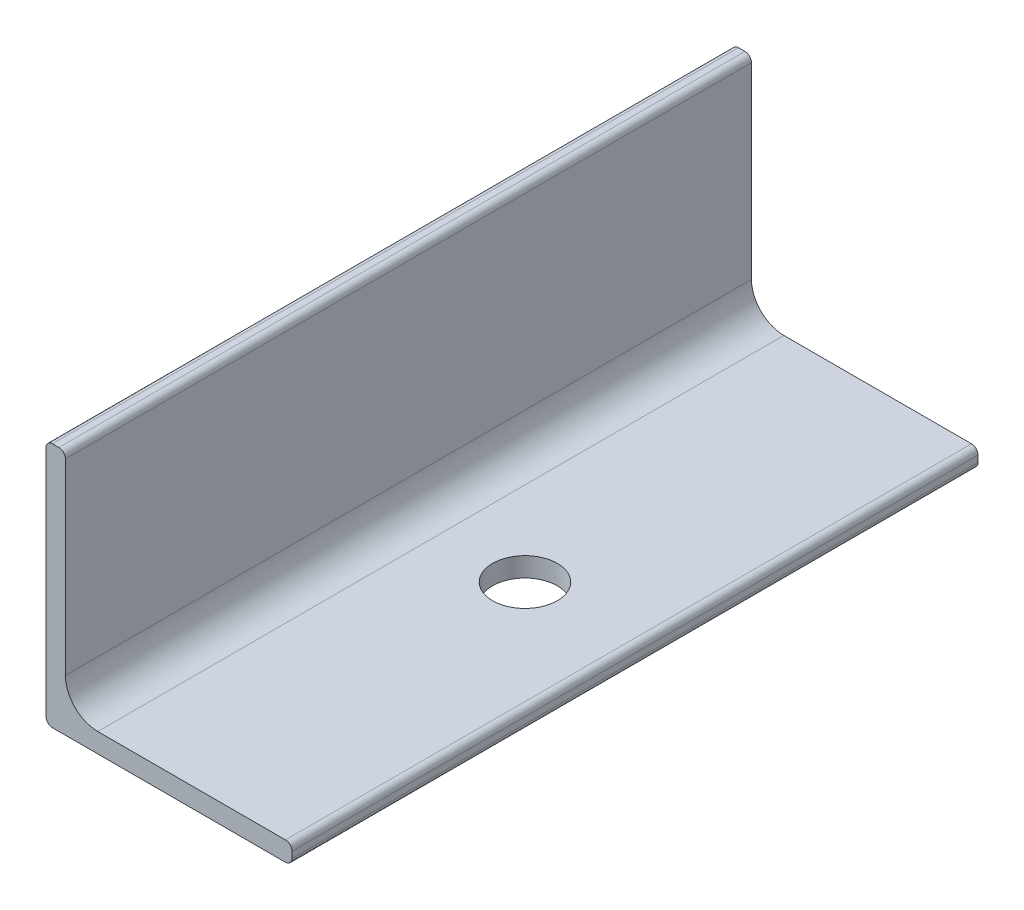
ISO-10303-21;
HEADER;
FILE_DESCRIPTION(('STEP AP214'),'2;1');
FILE_NAME('part.step','',(''),(''),'','','');
FILE_SCHEMA(('AUTOMOTIVE_DESIGN { 1 0 10303 214 1 1 1 1 }'));
ENDSEC;
DATA;
#1=APPLICATION_CONTEXT('core data for automotive mechanical design processes');
#2=APPLICATION_PROTOCOL_DEFINITION('international standard','automotive_design',2000,#1);
#3=PRODUCT_CONTEXT('',#1,'mechanical');
#4=PRODUCT('Part','Part','',(#3));
#5=PRODUCT_RELATED_PRODUCT_CATEGORY('part','',(#4));
#6=PRODUCT_DEFINITION_FORMATION('','',#4);
#7=PRODUCT_DEFINITION_CONTEXT('part definition',#1,'design');
#8=PRODUCT_DEFINITION('design','',#6,#7);
#9=PRODUCT_DEFINITION_SHAPE('','',#8);
#10=(LENGTH_UNIT() NAMED_UNIT(*) SI_UNIT(.MILLI.,.METRE.));
#11=(NAMED_UNIT(*) PLANE_ANGLE_UNIT() SI_UNIT($,.RADIAN.));
#12=(NAMED_UNIT(*) SI_UNIT($,.STERADIAN.) SOLID_ANGLE_UNIT());
#13=UNCERTAINTY_MEASURE_WITH_UNIT(LENGTH_MEASURE(1.E-05),#10,'distance_accuracy_value','');
#14=(GEOMETRIC_REPRESENTATION_CONTEXT(3) GLOBAL_UNCERTAINTY_ASSIGNED_CONTEXT((#13)) GLOBAL_UNIT_ASSIGNED_CONTEXT((#10,
#11,#12)) REPRESENTATION_CONTEXT('',''));
#15=CARTESIAN_POINT('',(0.,0.,0.));
#16=DIRECTION('',(0.,0.,1.));
#17=DIRECTION('',(1.,0.,0.));
#18=AXIS2_PLACEMENT_3D('',#15,#16,#17);
#19=CARTESIAN_POINT('',(8.,8.,53.));
#20=DIRECTION('',(0.,0.,-1.));
#21=DIRECTION('',(-1.,0.,0.));
#22=AXIS2_PLACEMENT_3D('',#19,#20,#21);
#23=CYLINDRICAL_SURFACE('',#22,5.);
#24=CARTESIAN_POINT('',(8.,8.,-53.));
#25=DIRECTION('',(0.,0.,-1.));
#26=DIRECTION('',(1.,0.,0.));
#27=AXIS2_PLACEMENT_3D('',#24,#25,#26);
#28=CIRCLE('',#27,5.);
#29=CARTESIAN_POINT('',(8.00000000000004,3.,-53.));
#30=VERTEX_POINT('',#29);
#31=CARTESIAN_POINT('',(3.,8.00000000000004,-53.));
#32=VERTEX_POINT('',#31);
#33=EDGE_CURVE('E161',#30,#32,#28,.T.);
#34=ORIENTED_EDGE('',*,*,#33,.T.);
#35=DIRECTION('',(0.,0.,-1.));
#36=VECTOR('',#35,1.);
#37=CARTESIAN_POINT('',(3.,8.00000000000004,53.));
#38=LINE('',#37,#36);
#39=CARTESIAN_POINT('',(3.,8.00000000000004,53.));
#40=VERTEX_POINT('',#39);
#41=EDGE_CURVE('E11',#40,#32,#38,.T.);
#42=ORIENTED_EDGE('',*,*,#41,.F.);
#43=CARTESIAN_POINT('',(8.,8.,53.));
#44=DIRECTION('',(0.,0.,-1.));
#45=DIRECTION('',(1.,0.,0.));
#46=AXIS2_PLACEMENT_3D('',#43,#44,#45);
#47=CIRCLE('',#46,5.);
#48=CARTESIAN_POINT('',(8.00000000000004,3.,53.));
#49=VERTEX_POINT('',#48);
#50=EDGE_CURVE('E184',#49,#40,#47,.T.);
#51=ORIENTED_EDGE('',*,*,#50,.F.);
#52=DIRECTION('',(0.,0.,-1.));
#53=VECTOR('',#52,1.);
#54=CARTESIAN_POINT('',(8.00000000000004,3.,53.));
#55=LINE('',#54,#53);
#56=EDGE_CURVE('E157',#49,#30,#55,.T.);
#57=ORIENTED_EDGE('',*,*,#56,.T.);
#58=EDGE_LOOP('',(#34,#42,#51,#57));
#59=FACE_BOUND('',#58,.T.);
#60=ADVANCED_FACE('F41',(#59),#23,.F.);
#61=CARTESIAN_POINT('',(3.,37.,53.));
#62=DIRECTION('',(-1.,0.,0.));
#63=DIRECTION('',(0.,-1.,0.));
#64=AXIS2_PLACEMENT_3D('',#61,#62,#63);
#65=PLANE('',#64);
#66=DIRECTION('',(0.,1.,0.));
#67=VECTOR('',#66,1.);
#68=CARTESIAN_POINT('',(3.,37.,-53.));
#69=LINE('',#68,#67);
#70=CARTESIAN_POINT('',(3.,37.,-53.));
#71=VERTEX_POINT('',#70);
#72=EDGE_CURVE('E164',#32,#71,#69,.T.);
#73=ORIENTED_EDGE('',*,*,#72,.T.);
#74=DIRECTION('',(0.,0.,-1.));
#75=VECTOR('',#74,1.);
#76=CARTESIAN_POINT('',(3.,37.,53.));
#77=LINE('',#76,#75);
#78=CARTESIAN_POINT('',(3.,37.,53.));
#79=VERTEX_POINT('',#78);
#80=EDGE_CURVE('E49',#79,#71,#77,.T.);
#81=ORIENTED_EDGE('',*,*,#80,.F.);
#82=DIRECTION('',(0.,1.,0.));
#83=VECTOR('',#82,1.);
#84=CARTESIAN_POINT('',(3.,37.,53.));
#85=LINE('',#84,#83);
#86=EDGE_CURVE('E112',#40,#79,#85,.T.);
#87=ORIENTED_EDGE('',*,*,#86,.F.);
#88=ORIENTED_EDGE('',*,*,#41,.T.);
#89=EDGE_LOOP('',(#73,#81,#87,#88));
#90=FACE_BOUND('',#89,.T.);
#91=ADVANCED_FACE('F266',(#90),#65,.F.);
#92=CARTESIAN_POINT('',(2.,37.,53.));
#93=DIRECTION('',(0.,0.,-1.));
#94=DIRECTION('',(-1.,0.,0.));
#95=AXIS2_PLACEMENT_3D('',#92,#93,#94);
#96=CYLINDRICAL_SURFACE('',#95,1.);
#97=CARTESIAN_POINT('',(2.,37.,-53.));
#98=DIRECTION('',(0.,0.,1.));
#99=DIRECTION('',(-1.,0.,0.));
#100=AXIS2_PLACEMENT_3D('',#97,#98,#99);
#101=CIRCLE('',#100,1.);
#102=CARTESIAN_POINT('',(1.99999999999999,38.,-53.));
#103=VERTEX_POINT('',#102);
#104=EDGE_CURVE('E167',#71,#103,#101,.T.);
#105=ORIENTED_EDGE('',*,*,#104,.T.);
#106=DIRECTION('',(0.,0.,-1.));
#107=VECTOR('',#106,1.);
#108=CARTESIAN_POINT('',(1.99999999999999,38.,53.));
#109=LINE('',#108,#107);
#110=CARTESIAN_POINT('',(1.99999999999999,38.,53.));
#111=VERTEX_POINT('',#110);
#112=EDGE_CURVE('E203',#111,#103,#109,.T.);
#113=ORIENTED_EDGE('',*,*,#112,.F.);
#114=CARTESIAN_POINT('',(2.,37.,53.));
#115=DIRECTION('',(0.,0.,1.));
#116=DIRECTION('',(-1.,0.,0.));
#117=AXIS2_PLACEMENT_3D('',#114,#115,#116);
#118=CIRCLE('',#117,1.);
#119=EDGE_CURVE('E211',#79,#111,#118,.T.);
#120=ORIENTED_EDGE('',*,*,#119,.F.);
#121=ORIENTED_EDGE('',*,*,#80,.T.);
#122=EDGE_LOOP('',(#105,#113,#120,#121));
#123=FACE_BOUND('',#122,.T.);
#124=ADVANCED_FACE('F209',(#123),#96,.T.);
#125=CARTESIAN_POINT('',(1.00000000000001,38.,53.));
#126=DIRECTION('',(0.,-1.,0.));
#127=DIRECTION('',(0.,0.,-1.));
#128=AXIS2_PLACEMENT_3D('',#125,#126,#127);
#129=PLANE('',#128);
#130=DIRECTION('',(-1.,0.,0.));
#131=VECTOR('',#130,1.);
#132=CARTESIAN_POINT('',(1.00000000000001,38.,-53.));
#133=LINE('',#132,#131);
#134=CARTESIAN_POINT('',(1.00000000000001,38.,-53.));
#135=VERTEX_POINT('',#134);
#136=EDGE_CURVE('E169',#103,#135,#133,.T.);
#137=ORIENTED_EDGE('',*,*,#136,.T.);
#138=DIRECTION('',(0.,0.,-1.));
#139=VECTOR('',#138,1.);
#140=CARTESIAN_POINT('',(1.00000000000001,38.,53.));
#141=LINE('',#140,#139);
#142=CARTESIAN_POINT('',(1.00000000000001,38.,53.));
#143=VERTEX_POINT('',#142);
#144=EDGE_CURVE('E200',#143,#135,#141,.T.);
#145=ORIENTED_EDGE('',*,*,#144,.F.);
#146=DIRECTION('',(-1.,0.,0.));
#147=VECTOR('',#146,1.);
#148=CARTESIAN_POINT('',(1.00000000000001,38.,53.));
#149=LINE('',#148,#147);
#150=EDGE_CURVE('E229',#111,#143,#149,.T.);
#151=ORIENTED_EDGE('',*,*,#150,.F.);
#152=ORIENTED_EDGE('',*,*,#112,.T.);
#153=EDGE_LOOP('',(#137,#145,#151,#152));
#154=FACE_BOUND('',#153,.T.);
#155=ADVANCED_FACE('F220',(#154),#129,.F.);
#156=CARTESIAN_POINT('',(1.,37.,53.));
#157=DIRECTION('',(0.,0.,-1.));
#158=DIRECTION('',(-1.,0.,0.));
#159=AXIS2_PLACEMENT_3D('',#156,#157,#158);
#160=CYLINDRICAL_SURFACE('',#159,1.);
#161=CARTESIAN_POINT('',(1.,37.,-53.));
#162=DIRECTION('',(0.,0.,1.));
#163=DIRECTION('',(-1.,0.,0.));
#164=AXIS2_PLACEMENT_3D('',#161,#162,#163);
#165=CIRCLE('',#164,1.);
#166=CARTESIAN_POINT('',(0.,37.,-53.));
#167=VERTEX_POINT('',#166);
#168=EDGE_CURVE('E171',#135,#167,#165,.T.);
#169=ORIENTED_EDGE('',*,*,#168,.T.);
#170=DIRECTION('',(0.,0.,-1.));
#171=VECTOR('',#170,1.);
#172=CARTESIAN_POINT('',(0.,37.,53.));
#173=LINE('',#172,#171);
#174=CARTESIAN_POINT('',(0.,37.,53.));
#175=VERTEX_POINT('',#174);
#176=EDGE_CURVE('E197',#175,#167,#173,.T.);
#177=ORIENTED_EDGE('',*,*,#176,.F.);
#178=CARTESIAN_POINT('',(1.,37.,53.));
#179=DIRECTION('',(0.,0.,1.));
#180=DIRECTION('',(-1.,0.,0.));
#181=AXIS2_PLACEMENT_3D('',#178,#179,#180);
#182=CIRCLE('',#181,1.);
#183=EDGE_CURVE('E226',#143,#175,#182,.T.);
#184=ORIENTED_EDGE('',*,*,#183,.F.);
#185=ORIENTED_EDGE('',*,*,#144,.T.);
#186=EDGE_LOOP('',(#169,#177,#184,#185));
#187=FACE_BOUND('',#186,.T.);
#188=ADVANCED_FACE('F224',(#187),#160,.T.);
#189=CARTESIAN_POINT('',(0.,1.00000000000001,53.));
#190=DIRECTION('',(1.,0.,0.));
#191=DIRECTION('',(0.,0.,-1.));
#192=AXIS2_PLACEMENT_3D('',#189,#190,#191);
#193=PLANE('',#192);
#194=DIRECTION('',(0.,-1.,0.));
#195=VECTOR('',#194,1.);
#196=CARTESIAN_POINT('',(0.,1.00000000000001,-53.));
#197=LINE('',#196,#195);
#198=CARTESIAN_POINT('',(0.,1.00000000000001,-53.));
#199=VERTEX_POINT('',#198);
#200=EDGE_CURVE('E173',#167,#199,#197,.T.);
#201=ORIENTED_EDGE('',*,*,#200,.T.);
#202=DIRECTION('',(0.,0.,-1.));
#203=VECTOR('',#202,1.);
#204=CARTESIAN_POINT('',(0.,1.00000000000001,53.));
#205=LINE('',#204,#203);
#206=CARTESIAN_POINT('',(0.,1.00000000000001,53.));
#207=VERTEX_POINT('',#206);
#208=EDGE_CURVE('E194',#207,#199,#205,.T.);
#209=ORIENTED_EDGE('',*,*,#208,.F.);
#210=DIRECTION('',(0.,-1.,0.));
#211=VECTOR('',#210,1.);
#212=CARTESIAN_POINT('',(0.,1.00000000000001,53.));
#213=LINE('',#212,#211);
#214=EDGE_CURVE('E228',#175,#207,#213,.T.);
#215=ORIENTED_EDGE('',*,*,#214,.F.);
#216=ORIENTED_EDGE('',*,*,#176,.T.);
#217=EDGE_LOOP('',(#201,#209,#215,#216));
#218=FACE_BOUND('',#217,.T.);
#219=ADVANCED_FACE('F279',(#218),#193,.F.);
#220=CARTESIAN_POINT('',(1.,1.,53.));
#221=DIRECTION('',(0.,0.,-1.));
#222=DIRECTION('',(-1.,0.,0.));
#223=AXIS2_PLACEMENT_3D('',#220,#221,#222);
#224=CYLINDRICAL_SURFACE('',#223,1.);
#225=CARTESIAN_POINT('',(1.,1.,-53.));
#226=DIRECTION('',(0.,0.,1.));
#227=DIRECTION('',(1.,0.,0.));
#228=AXIS2_PLACEMENT_3D('',#225,#226,#227);
#229=CIRCLE('',#228,1.);
#230=CARTESIAN_POINT('',(1.00000000000001,0.,-53.));
#231=VERTEX_POINT('',#230);
#232=EDGE_CURVE('E175',#199,#231,#229,.T.);
#233=ORIENTED_EDGE('',*,*,#232,.T.);
#234=DIRECTION('',(0.,0.,-1.));
#235=VECTOR('',#234,1.);
#236=CARTESIAN_POINT('',(1.00000000000001,0.,53.));
#237=LINE('',#236,#235);
#238=CARTESIAN_POINT('',(1.00000000000001,0.,53.));
#239=VERTEX_POINT('',#238);
#240=EDGE_CURVE('E191',#239,#231,#237,.T.);
#241=ORIENTED_EDGE('',*,*,#240,.F.);
#242=CARTESIAN_POINT('',(1.,1.,53.));
#243=DIRECTION('',(0.,0.,1.));
#244=DIRECTION('',(1.,0.,0.));
#245=AXIS2_PLACEMENT_3D('',#242,#243,#244);
#246=CIRCLE('',#245,1.);
#247=EDGE_CURVE('E231',#207,#239,#246,.T.);
#248=ORIENTED_EDGE('',*,*,#247,.F.);
#249=ORIENTED_EDGE('',*,*,#208,.T.);
#250=EDGE_LOOP('',(#233,#241,#248,#249));
#251=FACE_BOUND('',#250,.T.);
#252=ADVANCED_FACE('F282',(#251),#224,.T.);
#253=CARTESIAN_POINT('',(37.,0.,53.));
#254=DIRECTION('',(0.,1.,0.));
#255=DIRECTION('',(0.,0.,1.));
#256=AXIS2_PLACEMENT_3D('',#253,#254,#255);
#257=PLANE('',#256);
#258=CARTESIAN_POINT('',(21.,0.,0.));
#259=DIRECTION('',(0.,1.,0.));
#260=DIRECTION('',(0.,0.,1.));
#261=AXIS2_PLACEMENT_3D('',#258,#259,#260);
#262=CIRCLE('',#261,5.);
#263=CARTESIAN_POINT('',(21.,0.,5.));
#264=VERTEX_POINT('',#263);
#265=EDGE_CURVE('E165',#264,#264,#262,.T.);
#266=ORIENTED_EDGE('',*,*,#265,.T.);
#267=EDGE_LOOP('',(#266));
#268=FACE_BOUND('',#267,.T.);
#269=DIRECTION('',(1.,0.,0.));
#270=VECTOR('',#269,1.);
#271=CARTESIAN_POINT('',(37.,0.,-53.));
#272=LINE('',#271,#270);
#273=CARTESIAN_POINT('',(37.,0.,-53.));
#274=VERTEX_POINT('',#273);
#275=EDGE_CURVE('E177',#231,#274,#272,.T.);
#276=ORIENTED_EDGE('',*,*,#275,.T.);
#277=DIRECTION('',(0.,0.,-1.));
#278=VECTOR('',#277,1.);
#279=CARTESIAN_POINT('',(37.,0.,53.));
#280=LINE('',#279,#278);
#281=CARTESIAN_POINT('',(37.,0.,53.));
#282=VERTEX_POINT('',#281);
#283=EDGE_CURVE('E188',#282,#274,#280,.T.);
#284=ORIENTED_EDGE('',*,*,#283,.F.);
#285=DIRECTION('',(1.,0.,0.));
#286=VECTOR('',#285,1.);
#287=CARTESIAN_POINT('',(37.,0.,53.));
#288=LINE('',#287,#286);
#289=EDGE_CURVE('E237',#239,#282,#288,.T.);
#290=ORIENTED_EDGE('',*,*,#289,.F.);
#291=ORIENTED_EDGE('',*,*,#240,.T.);
#292=EDGE_LOOP('',(#276,#284,#290,#291));
#293=FACE_BOUND('',#292,.T.);
#294=ADVANCED_FACE('F243',(#268,#293),#257,.F.);
#295=CARTESIAN_POINT('',(37.,1.,53.));
#296=DIRECTION('',(0.,0.,-1.));
#297=DIRECTION('',(-1.,0.,0.));
#298=AXIS2_PLACEMENT_3D('',#295,#296,#297);
#299=CYLINDRICAL_SURFACE('',#298,1.);
#300=CARTESIAN_POINT('',(37.,1.,-53.));
#301=DIRECTION('',(0.,0.,1.));
#302=DIRECTION('',(-1.,0.,0.));
#303=AXIS2_PLACEMENT_3D('',#300,#301,#302);
#304=CIRCLE('',#303,1.);
#305=CARTESIAN_POINT('',(38.,1.00000000000001,-53.));
#306=VERTEX_POINT('',#305);
#307=EDGE_CURVE('E179',#274,#306,#304,.T.);
#308=ORIENTED_EDGE('',*,*,#307,.T.);
#309=DIRECTION('',(0.,0.,-1.));
#310=VECTOR('',#309,1.);
#311=CARTESIAN_POINT('',(38.,1.00000000000001,53.));
#312=LINE('',#311,#310);
#313=CARTESIAN_POINT('',(38.,1.00000000000001,53.));
#314=VERTEX_POINT('',#313);
#315=EDGE_CURVE('E152',#314,#306,#312,.T.);
#316=ORIENTED_EDGE('',*,*,#315,.F.);
#317=CARTESIAN_POINT('',(37.,1.,53.));
#318=DIRECTION('',(0.,0.,1.));
#319=DIRECTION('',(-1.,0.,0.));
#320=AXIS2_PLACEMENT_3D('',#317,#318,#319);
#321=CIRCLE('',#320,1.);
#322=EDGE_CURVE('E143',#282,#314,#321,.T.);
#323=ORIENTED_EDGE('',*,*,#322,.F.);
#324=ORIENTED_EDGE('',*,*,#283,.T.);
#325=EDGE_LOOP('',(#308,#316,#323,#324));
#326=FACE_BOUND('',#325,.T.);
#327=ADVANCED_FACE('F247',(#326),#299,.T.);
#328=CARTESIAN_POINT('',(38.,1.99999999999999,53.));
#329=DIRECTION('',(-1.,0.,0.));
#330=DIRECTION('',(0.,0.,1.));
#331=AXIS2_PLACEMENT_3D('',#328,#329,#330);
#332=PLANE('',#331);
#333=DIRECTION('',(0.,1.,0.));
#334=VECTOR('',#333,1.);
#335=CARTESIAN_POINT('',(38.,1.99999999999999,-53.));
#336=LINE('',#335,#334);
#337=CARTESIAN_POINT('',(38.,1.99999999999999,-53.));
#338=VERTEX_POINT('',#337);
#339=EDGE_CURVE('E151',#306,#338,#336,.T.);
#340=ORIENTED_EDGE('',*,*,#339,.T.);
#341=DIRECTION('',(0.,0.,-1.));
#342=VECTOR('',#341,1.);
#343=CARTESIAN_POINT('',(38.,1.99999999999999,53.));
#344=LINE('',#343,#342);
#345=CARTESIAN_POINT('',(38.,1.99999999999999,53.));
#346=VERTEX_POINT('',#345);
#347=EDGE_CURVE('E148',#346,#338,#344,.T.);
#348=ORIENTED_EDGE('',*,*,#347,.F.);
#349=DIRECTION('',(0.,1.,0.));
#350=VECTOR('',#349,1.);
#351=CARTESIAN_POINT('',(38.,1.99999999999999,53.));
#352=LINE('',#351,#350);
#353=EDGE_CURVE('E137',#314,#346,#352,.T.);
#354=ORIENTED_EDGE('',*,*,#353,.F.);
#355=ORIENTED_EDGE('',*,*,#315,.T.);
#356=EDGE_LOOP('',(#340,#348,#354,#355));
#357=FACE_BOUND('',#356,.T.);
#358=ADVANCED_FACE('F149',(#357),#332,.F.);
#359=CARTESIAN_POINT('',(37.,2.,53.));
#360=DIRECTION('',(0.,0.,-1.));
#361=DIRECTION('',(-1.,0.,0.));
#362=AXIS2_PLACEMENT_3D('',#359,#360,#361);
#363=CYLINDRICAL_SURFACE('',#362,1.);
#364=CARTESIAN_POINT('',(37.,2.,-53.));
#365=DIRECTION('',(0.,0.,1.));
#366=DIRECTION('',(-1.,0.,0.));
#367=AXIS2_PLACEMENT_3D('',#364,#365,#366);
#368=CIRCLE('',#367,1.);
#369=CARTESIAN_POINT('',(37.,3.,-53.));
#370=VERTEX_POINT('',#369);
#371=EDGE_CURVE('E98',#338,#370,#368,.T.);
#372=ORIENTED_EDGE('',*,*,#371,.T.);
#373=DIRECTION('',(0.,0.,-1.));
#374=VECTOR('',#373,1.);
#375=CARTESIAN_POINT('',(37.,3.,53.));
#376=LINE('',#375,#374);
#377=CARTESIAN_POINT('',(37.,3.,53.));
#378=VERTEX_POINT('',#377);
#379=EDGE_CURVE('E153',#378,#370,#376,.T.);
#380=ORIENTED_EDGE('',*,*,#379,.F.);
#381=CARTESIAN_POINT('',(37.,2.,53.));
#382=DIRECTION('',(0.,0.,1.));
#383=DIRECTION('',(-1.,0.,0.));
#384=AXIS2_PLACEMENT_3D('',#381,#382,#383);
#385=CIRCLE('',#384,1.);
#386=EDGE_CURVE('E141',#346,#378,#385,.T.);
#387=ORIENTED_EDGE('',*,*,#386,.F.);
#388=ORIENTED_EDGE('',*,*,#347,.T.);
#389=EDGE_LOOP('',(#372,#380,#387,#388));
#390=FACE_BOUND('',#389,.T.);
#391=ADVANCED_FACE('F155',(#390),#363,.T.);
#392=CARTESIAN_POINT('',(8.00000000000004,3.,53.));
#393=DIRECTION('',(0.,-1.,0.));
#394=DIRECTION('',(0.,0.,-1.));
#395=AXIS2_PLACEMENT_3D('',#392,#393,#394);
#396=PLANE('',#395);
#397=CARTESIAN_POINT('',(21.,3.,0.));
#398=DIRECTION('',(0.,1.,0.));
#399=DIRECTION('',(0.,0.,1.));
#400=AXIS2_PLACEMENT_3D('',#397,#398,#399);
#401=CIRCLE('',#400,5.);
#402=CARTESIAN_POINT('',(21.,3.,5.));
#403=VERTEX_POINT('',#402);
#404=EDGE_CURVE('E351',#403,#403,#401,.T.);
#405=ORIENTED_EDGE('',*,*,#404,.F.);
#406=EDGE_LOOP('',(#405));
#407=FACE_BOUND('',#406,.T.);
#408=DIRECTION('',(-1.,0.,0.));
#409=VECTOR('',#408,1.);
#410=CARTESIAN_POINT('',(8.00000000000004,3.,-53.));
#411=LINE('',#410,#409);
#412=EDGE_CURVE('E104',#370,#30,#411,.T.);
#413=ORIENTED_EDGE('',*,*,#412,.T.);
#414=ORIENTED_EDGE('',*,*,#56,.F.);
#415=DIRECTION('',(-1.,0.,0.));
#416=VECTOR('',#415,1.);
#417=CARTESIAN_POINT('',(8.00000000000004,3.,53.));
#418=LINE('',#417,#416);
#419=EDGE_CURVE('E57',#378,#49,#418,.T.);
#420=ORIENTED_EDGE('',*,*,#419,.F.);
#421=ORIENTED_EDGE('',*,*,#379,.T.);
#422=EDGE_LOOP('',(#413,#414,#420,#421));
#423=FACE_BOUND('',#422,.T.);
#424=ADVANCED_FACE('F251',(#407,#423),#396,.F.);
#425=CARTESIAN_POINT('',(8.,8.,53.));
#426=DIRECTION('',(0.,0.,1.));
#427=DIRECTION('',(1.,0.,0.));
#428=AXIS2_PLACEMENT_3D('',#425,#426,#427);
#429=PLANE('',#428);
#430=ORIENTED_EDGE('',*,*,#50,.T.);
#431=ORIENTED_EDGE('',*,*,#86,.T.);
#432=ORIENTED_EDGE('',*,*,#119,.T.);
#433=ORIENTED_EDGE('',*,*,#150,.T.);
#434=ORIENTED_EDGE('',*,*,#183,.T.);
#435=ORIENTED_EDGE('',*,*,#214,.T.);
#436=ORIENTED_EDGE('',*,*,#247,.T.);
#437=ORIENTED_EDGE('',*,*,#289,.T.);
#438=ORIENTED_EDGE('',*,*,#322,.T.);
#439=ORIENTED_EDGE('',*,*,#353,.T.);
#440=ORIENTED_EDGE('',*,*,#386,.T.);
#441=ORIENTED_EDGE('',*,*,#419,.T.);
#442=EDGE_LOOP('',(#430,#431,#432,#433,#434,#435,#436,#437,#438,#439,#440,#441));
#443=FACE_BOUND('',#442,.T.);
#444=ADVANCED_FACE('F139',(#443),#429,.T.);
#445=CARTESIAN_POINT('',(8.,8.,-53.));
#446=DIRECTION('',(0.,0.,1.));
#447=DIRECTION('',(1.,0.,0.));
#448=AXIS2_PLACEMENT_3D('',#445,#446,#447);
#449=PLANE('',#448);
#450=ORIENTED_EDGE('',*,*,#33,.F.);
#451=ORIENTED_EDGE('',*,*,#412,.F.);
#452=ORIENTED_EDGE('',*,*,#371,.F.);
#453=ORIENTED_EDGE('',*,*,#339,.F.);
#454=ORIENTED_EDGE('',*,*,#307,.F.);
#455=ORIENTED_EDGE('',*,*,#275,.F.);
#456=ORIENTED_EDGE('',*,*,#232,.F.);
#457=ORIENTED_EDGE('',*,*,#200,.F.);
#458=ORIENTED_EDGE('',*,*,#168,.F.);
#459=ORIENTED_EDGE('',*,*,#136,.F.);
#460=ORIENTED_EDGE('',*,*,#104,.F.);
#461=ORIENTED_EDGE('',*,*,#72,.F.);
#462=EDGE_LOOP('',(#450,#451,#452,#453,#454,#455,#456,#457,#458,#459,#460,#461));
#463=FACE_BOUND('',#462,.T.);
#464=ADVANCED_FACE('F215',(#463),#449,.F.);
#465=CARTESIAN_POINT('',(21.,0.,0.));
#466=DIRECTION('',(0.,1.,0.));
#467=DIRECTION('',(0.,0.,1.));
#468=AXIS2_PLACEMENT_3D('',#465,#466,#467);
#469=CYLINDRICAL_SURFACE('',#468,5.);
#470=ORIENTED_EDGE('',*,*,#265,.F.);
#471=EDGE_LOOP('',(#470));
#472=FACE_BOUND('',#471,.T.);
#473=ORIENTED_EDGE('',*,*,#404,.T.);
#474=EDGE_LOOP('',(#473));
#475=FACE_BOUND('',#474,.T.);
#476=ADVANCED_FACE('F312',(#472,#475),#469,.F.);
#477=CLOSED_SHELL('',(#60,#91,#124,#155,#188,#219,#252,#294,#327,#358,#391,#424,#444,#464,#476));
#478=MANIFOLD_SOLID_BREP('B2',#477);
#479=ADVANCED_BREP_SHAPE_REPRESENTATION('',(#18,#478),#14);
#480=SHAPE_DEFINITION_REPRESENTATION(#9,#479);
ENDSEC;
END-ISO-10303-21;
